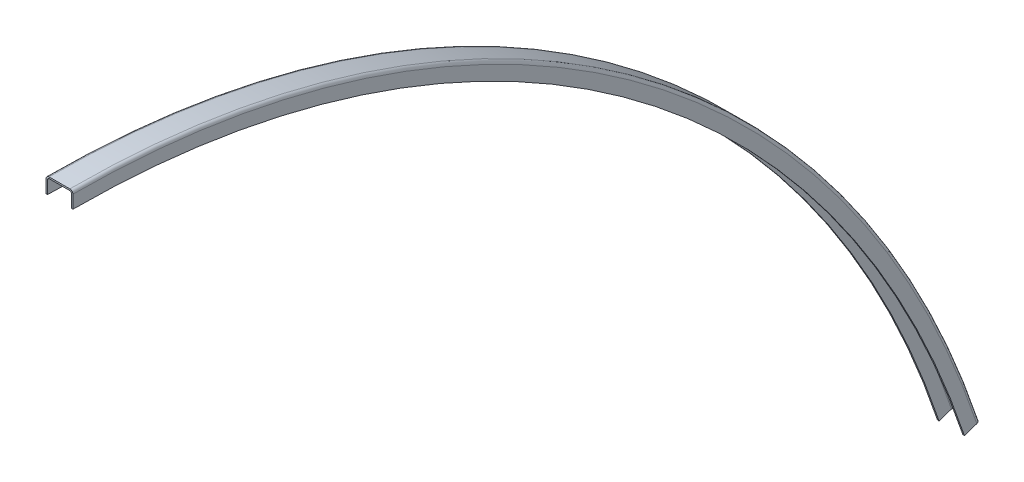
ISO-10303-21;
HEADER;
FILE_DESCRIPTION(('STEP AP214'),'2;1');
FILE_NAME('part.step','',(''),(''),'','','');
FILE_SCHEMA(('AUTOMOTIVE_DESIGN { 1 0 10303 214 1 1 1 1 }'));
ENDSEC;
DATA;
#1=APPLICATION_CONTEXT('core data for automotive mechanical design processes');
#2=APPLICATION_PROTOCOL_DEFINITION('international standard','automotive_design',2000,#1);
#3=PRODUCT_CONTEXT('',#1,'mechanical');
#4=PRODUCT('Part','Part','',(#3));
#5=PRODUCT_RELATED_PRODUCT_CATEGORY('part','',(#4));
#6=PRODUCT_DEFINITION_FORMATION('','',#4);
#7=PRODUCT_DEFINITION_CONTEXT('part definition',#1,'design');
#8=PRODUCT_DEFINITION('design','',#6,#7);
#9=PRODUCT_DEFINITION_SHAPE('','',#8);
#10=(LENGTH_UNIT() NAMED_UNIT(*) SI_UNIT(.MILLI.,.METRE.));
#11=(NAMED_UNIT(*) PLANE_ANGLE_UNIT() SI_UNIT($,.RADIAN.));
#12=(NAMED_UNIT(*) SI_UNIT($,.STERADIAN.) SOLID_ANGLE_UNIT());
#13=UNCERTAINTY_MEASURE_WITH_UNIT(LENGTH_MEASURE(1.E-05),#10,'distance_accuracy_value','');
#14=(GEOMETRIC_REPRESENTATION_CONTEXT(3) GLOBAL_UNCERTAINTY_ASSIGNED_CONTEXT((#13)) GLOBAL_UNIT_ASSIGNED_CONTEXT((#10,
#11,#12)) REPRESENTATION_CONTEXT('',''));
#15=CARTESIAN_POINT('',(0.,0.,0.));
#16=DIRECTION('',(0.,0.,1.));
#17=DIRECTION('',(1.,0.,0.));
#18=AXIS2_PLACEMENT_3D('',#15,#16,#17);
#19=CARTESIAN_POINT('',(14.479414078454,-1185.51851851852,0.));
#20=DIRECTION('',(1.,0.,0.));
#21=DIRECTION('',(0.,0.,-1.));
#22=AXIS2_PLACEMENT_3D('',#19,#20,#21);
#23=CYLINDRICAL_SURFACE('',#22,1223.5);
#24=CARTESIAN_POINT('',(-23.2037037037037,-1185.51851851852,0.));
#25=DIRECTION('',(1.,0.,0.));
#26=DIRECTION('',(0.,0.,-1.));
#27=AXIS2_PLACEMENT_3D('',#24,#25,#26);
#28=CIRCLE('',#27,1223.5);
#29=CARTESIAN_POINT('',(-23.2037037037037,-797.296271406891,-1160.27399214479));
#30=VERTEX_POINT('',#29);
#31=CARTESIAN_POINT('',(-23.2037037037037,37.9814814814815,0.));
#32=VERTEX_POINT('',#31);
#33=EDGE_CURVE('E11',#30,#32,#28,.T.);
#34=ORIENTED_EDGE('',*,*,#33,.F.);
#35=DIRECTION('',(1.,0.,0.));
#36=VECTOR('',#35,1.);
#37=CARTESIAN_POINT('',(-21.2037037037037,-797.296271406891,-1160.27399214479));
#38=LINE('',#37,#36);
#39=CARTESIAN_POINT('',(-21.2037037037037,-797.296271406891,-1160.27399214479));
#40=VERTEX_POINT('',#39);
#41=EDGE_CURVE('E123',#30,#40,#38,.T.);
#42=ORIENTED_EDGE('',*,*,#41,.T.);
#43=CARTESIAN_POINT('',(-21.2037037037037,-1185.51851851852,0.));
#44=DIRECTION('',(1.,0.,0.));
#45=DIRECTION('',(0.,0.,-1.));
#46=AXIS2_PLACEMENT_3D('',#43,#44,#45);
#47=CIRCLE('',#46,1223.5);
#48=CARTESIAN_POINT('',(-21.2037037037037,37.9814814814815,0.));
#49=VERTEX_POINT('',#48);
#50=EDGE_CURVE('E118',#40,#49,#47,.T.);
#51=ORIENTED_EDGE('',*,*,#50,.T.);
#52=DIRECTION('',(1.,0.,0.));
#53=VECTOR('',#52,1.);
#54=CARTESIAN_POINT('',(-21.2037037037037,37.9814814814815,0.));
#55=LINE('',#54,#53);
#56=EDGE_CURVE('E121',#32,#49,#55,.T.);
#57=ORIENTED_EDGE('',*,*,#56,.F.);
#58=EDGE_LOOP('',(#34,#42,#51,#57));
#59=FACE_BOUND('',#58,.T.);
#60=ADVANCED_FACE('F34',(#59),#23,.F.);
#61=CARTESIAN_POINT('',(-23.2037037037037,-797.296271406891,-1160.27399214479));
#62=DIRECTION('',(-1.,0.,0.));
#63=DIRECTION('',(0.,0.,1.));
#64=AXIS2_PLACEMENT_3D('',#61,#62,#63);
#65=PLANE('',#64);
#66=CARTESIAN_POINT('',(-23.2037037037037,-1185.51851851852,0.));
#67=DIRECTION('',(1.,0.,0.));
#68=DIRECTION('',(0.,0.,-1.));
#69=AXIS2_PLACEMENT_3D('',#66,#67,#68);
#70=CIRCLE('',#69,1240.5);
#71=CARTESIAN_POINT('',(-23.2037037037037,-791.902092248005,-1176.39549428329));
#72=VERTEX_POINT('',#71);
#73=CARTESIAN_POINT('',(-23.2037037037037,54.9814814814815,0.));
#74=VERTEX_POINT('',#73);
#75=EDGE_CURVE('E42',#72,#74,#70,.T.);
#76=ORIENTED_EDGE('',*,*,#75,.F.);
#77=DIRECTION('',(0.,-0.31730465640509,0.9483236552062));
#78=VECTOR('',#77,1.);
#79=CARTESIAN_POINT('',(-23.2037037037037,-797.296271406891,-1160.27399214479));
#80=LINE('',#79,#78);
#81=EDGE_CURVE('E128',#72,#30,#80,.T.);
#82=ORIENTED_EDGE('',*,*,#81,.T.);
#83=ORIENTED_EDGE('',*,*,#33,.T.);
#84=DIRECTION('',(0.,-1.,0.));
#85=VECTOR('',#84,1.);
#86=CARTESIAN_POINT('',(-23.2037037037037,37.9814814814815,0.));
#87=LINE('',#86,#85);
#88=EDGE_CURVE('E141',#74,#32,#87,.T.);
#89=ORIENTED_EDGE('',*,*,#88,.F.);
#90=EDGE_LOOP('',(#76,#82,#83,#89));
#91=FACE_BOUND('',#90,.T.);
#92=ADVANCED_FACE('F36',(#91),#65,.T.);
#93=CARTESIAN_POINT('',(-19.2037037037037,-1185.51851851852,0.));
#94=DIRECTION('',(1.,0.,0.));
#95=DIRECTION('',(0.,0.,-1.));
#96=AXIS2_PLACEMENT_3D('',#93,#94,#95);
#97=TOROIDAL_SURFACE('',#96,1240.5,4.);
#98=CARTESIAN_POINT('',(-19.2037037037037,-1185.51851851852,0.));
#99=DIRECTION('',(1.,0.,0.));
#100=DIRECTION('',(0.,0.,-1.));
#101=AXIS2_PLACEMENT_3D('',#98,#99,#100);
#102=CIRCLE('',#101,1244.5);
#103=CARTESIAN_POINT('',(-19.2037037037037,-790.632873622385,-1180.18878890412));
#104=VERTEX_POINT('',#103);
#105=CARTESIAN_POINT('',(-19.2037037037037,58.9814814814815,0.));
#106=VERTEX_POINT('',#105);
#107=EDGE_CURVE('E214',#104,#106,#102,.T.);
#108=ORIENTED_EDGE('',*,*,#107,.F.);
#109=CARTESIAN_POINT('',(-19.2037037037037,-791.902092248005,-1176.39549428329));
#110=DIRECTION('',(0.,0.9483236552062,0.31730465640509));
#111=DIRECTION('',(-1.,0.,0.));
#112=AXIS2_PLACEMENT_3D('',#109,#110,#111);
#113=CIRCLE('',#112,4.);
#114=EDGE_CURVE('E196',#104,#72,#113,.T.);
#115=ORIENTED_EDGE('',*,*,#114,.T.);
#116=ORIENTED_EDGE('',*,*,#75,.T.);
#117=CARTESIAN_POINT('',(-19.2037037037037,54.9814814814815,0.));
#118=DIRECTION('',(0.,0.,1.));
#119=DIRECTION('',(-1.,0.,0.));
#120=AXIS2_PLACEMENT_3D('',#117,#118,#119);
#121=CIRCLE('',#120,4.);
#122=EDGE_CURVE('E166',#106,#74,#121,.T.);
#123=ORIENTED_EDGE('',*,*,#122,.F.);
#124=EDGE_LOOP('',(#108,#115,#116,#123));
#125=FACE_BOUND('',#124,.T.);
#126=ADVANCED_FACE('F217',(#125),#97,.T.);
#127=CARTESIAN_POINT('',(14.479414078454,-1185.51851851852,0.));
#128=DIRECTION('',(1.,0.,0.));
#129=DIRECTION('',(0.,0.,-1.));
#130=AXIS2_PLACEMENT_3D('',#127,#128,#129);
#131=CYLINDRICAL_SURFACE('',#130,1244.5);
#132=CARTESIAN_POINT('',(7.79629629629627,-1185.51851851852,0.));
#133=DIRECTION('',(1.,0.,0.));
#134=DIRECTION('',(0.,0.,-1.));
#135=AXIS2_PLACEMENT_3D('',#132,#133,#134);
#136=CIRCLE('',#135,1244.5);
#137=CARTESIAN_POINT('',(7.79629629629627,-790.632873622385,-1180.18878890412));
#138=VERTEX_POINT('',#137);
#139=CARTESIAN_POINT('',(7.79629629629627,58.9814814814815,0.));
#140=VERTEX_POINT('',#139);
#141=EDGE_CURVE('E212',#138,#140,#136,.T.);
#142=ORIENTED_EDGE('',*,*,#141,.F.);
#143=DIRECTION('',(-1.,0.,0.));
#144=VECTOR('',#143,1.);
#145=CARTESIAN_POINT('',(-19.2037037037037,-790.632873622385,-1180.18878890412));
#146=LINE('',#145,#144);
#147=EDGE_CURVE('E193',#138,#104,#146,.T.);
#148=ORIENTED_EDGE('',*,*,#147,.T.);
#149=ORIENTED_EDGE('',*,*,#107,.T.);
#150=DIRECTION('',(-1.,0.,0.));
#151=VECTOR('',#150,1.);
#152=CARTESIAN_POINT('',(-19.2037037037037,58.9814814814815,0.));
#153=LINE('',#152,#151);
#154=EDGE_CURVE('E163',#140,#106,#153,.T.);
#155=ORIENTED_EDGE('',*,*,#154,.F.);
#156=EDGE_LOOP('',(#142,#148,#149,#155));
#157=FACE_BOUND('',#156,.T.);
#158=ADVANCED_FACE('F252',(#157),#131,.T.);
#159=CARTESIAN_POINT('',(7.79629629629629,-1185.51851851852,0.));
#160=DIRECTION('',(1.,0.,0.));
#161=DIRECTION('',(0.,0.,-1.));
#162=AXIS2_PLACEMENT_3D('',#159,#160,#161);
#163=TOROIDAL_SURFACE('',#162,1240.5,4.);
#164=CARTESIAN_POINT('',(11.7962962962963,-1185.51851851852,0.));
#165=DIRECTION('',(1.,0.,0.));
#166=DIRECTION('',(0.,0.,-1.));
#167=AXIS2_PLACEMENT_3D('',#164,#165,#166);
#168=CIRCLE('',#167,1240.5);
#169=CARTESIAN_POINT('',(11.7962962962963,-791.902092248005,-1176.39549428329));
#170=VERTEX_POINT('',#169);
#171=CARTESIAN_POINT('',(11.7962962962963,54.9814814814815,0.));
#172=VERTEX_POINT('',#171);
#173=EDGE_CURVE('E210',#170,#172,#168,.T.);
#174=ORIENTED_EDGE('',*,*,#173,.F.);
#175=CARTESIAN_POINT('',(7.79629629629629,-791.902092248005,-1176.39549428329));
#176=DIRECTION('',(0.,0.9483236552062,0.31730465640509));
#177=DIRECTION('',(-1.,0.,0.));
#178=AXIS2_PLACEMENT_3D('',#175,#176,#177);
#179=CIRCLE('',#178,4.);
#180=EDGE_CURVE('E190',#170,#138,#179,.T.);
#181=ORIENTED_EDGE('',*,*,#180,.T.);
#182=ORIENTED_EDGE('',*,*,#141,.T.);
#183=CARTESIAN_POINT('',(7.79629629629629,54.9814814814815,0.));
#184=DIRECTION('',(0.,0.,1.));
#185=DIRECTION('',(-1.,0.,0.));
#186=AXIS2_PLACEMENT_3D('',#183,#184,#185);
#187=CIRCLE('',#186,4.);
#188=EDGE_CURVE('E160',#172,#140,#187,.T.);
#189=ORIENTED_EDGE('',*,*,#188,.F.);
#190=EDGE_LOOP('',(#174,#181,#182,#189));
#191=FACE_BOUND('',#190,.T.);
#192=ADVANCED_FACE('F249',(#191),#163,.T.);
#193=CARTESIAN_POINT('',(11.7962962962963,-791.902092248005,-1176.39549428329));
#194=DIRECTION('',(1.,0.,0.));
#195=DIRECTION('',(0.,0.,-1.));
#196=AXIS2_PLACEMENT_3D('',#193,#194,#195);
#197=PLANE('',#196);
#198=CARTESIAN_POINT('',(11.7962962962963,-1185.51851851852,0.));
#199=DIRECTION('',(1.,0.,0.));
#200=DIRECTION('',(0.,0.,-1.));
#201=AXIS2_PLACEMENT_3D('',#198,#199,#200);
#202=CIRCLE('',#201,1223.5);
#203=CARTESIAN_POINT('',(11.7962962962963,-797.296271406891,-1160.27399214479));
#204=VERTEX_POINT('',#203);
#205=CARTESIAN_POINT('',(11.7962962962963,37.9814814814815,0.));
#206=VERTEX_POINT('',#205);
#207=EDGE_CURVE('E208',#204,#206,#202,.T.);
#208=ORIENTED_EDGE('',*,*,#207,.F.);
#209=DIRECTION('',(0.,0.31730465640509,-0.9483236552062));
#210=VECTOR('',#209,1.);
#211=CARTESIAN_POINT('',(11.7962962962963,-791.902092248005,-1176.39549428329));
#212=LINE('',#211,#210);
#213=EDGE_CURVE('E187',#204,#170,#212,.T.);
#214=ORIENTED_EDGE('',*,*,#213,.T.);
#215=ORIENTED_EDGE('',*,*,#173,.T.);
#216=DIRECTION('',(0.,1.,0.));
#217=VECTOR('',#216,1.);
#218=CARTESIAN_POINT('',(11.7962962962963,54.9814814814815,0.));
#219=LINE('',#218,#217);
#220=EDGE_CURVE('E157',#206,#172,#219,.T.);
#221=ORIENTED_EDGE('',*,*,#220,.F.);
#222=EDGE_LOOP('',(#208,#214,#215,#221));
#223=FACE_BOUND('',#222,.T.);
#224=ADVANCED_FACE('F246',(#223),#197,.T.);
#225=CARTESIAN_POINT('',(14.479414078454,-1185.51851851852,0.));
#226=DIRECTION('',(1.,0.,0.));
#227=DIRECTION('',(0.,0.,-1.));
#228=AXIS2_PLACEMENT_3D('',#225,#226,#227);
#229=CYLINDRICAL_SURFACE('',#228,1223.5);
#230=CARTESIAN_POINT('',(9.7962962962963,-1185.51851851852,0.));
#231=DIRECTION('',(1.,0.,0.));
#232=DIRECTION('',(0.,0.,-1.));
#233=AXIS2_PLACEMENT_3D('',#230,#231,#232);
#234=CIRCLE('',#233,1223.5);
#235=CARTESIAN_POINT('',(9.7962962962963,-797.296271406891,-1160.27399214479));
#236=VERTEX_POINT('',#235);
#237=CARTESIAN_POINT('',(9.7962962962963,37.9814814814815,0.));
#238=VERTEX_POINT('',#237);
#239=EDGE_CURVE('E206',#236,#238,#234,.T.);
#240=ORIENTED_EDGE('',*,*,#239,.F.);
#241=DIRECTION('',(1.,0.,0.));
#242=VECTOR('',#241,1.);
#243=CARTESIAN_POINT('',(11.7962962962963,-797.296271406891,-1160.27399214479));
#244=LINE('',#243,#242);
#245=EDGE_CURVE('E184',#236,#204,#244,.T.);
#246=ORIENTED_EDGE('',*,*,#245,.T.);
#247=ORIENTED_EDGE('',*,*,#207,.T.);
#248=DIRECTION('',(1.,0.,0.));
#249=VECTOR('',#248,1.);
#250=CARTESIAN_POINT('',(11.7962962962963,37.9814814814815,0.));
#251=LINE('',#250,#249);
#252=EDGE_CURVE('E154',#238,#206,#251,.T.);
#253=ORIENTED_EDGE('',*,*,#252,.F.);
#254=EDGE_LOOP('',(#240,#246,#247,#253));
#255=FACE_BOUND('',#254,.T.);
#256=ADVANCED_FACE('F241',(#255),#229,.F.);
#257=CARTESIAN_POINT('',(9.7962962962963,-797.296271406891,-1160.27399214479));
#258=DIRECTION('',(-1.,0.,0.));
#259=DIRECTION('',(0.,0.,1.));
#260=AXIS2_PLACEMENT_3D('',#257,#258,#259);
#261=PLANE('',#260);
#262=CARTESIAN_POINT('',(9.7962962962963,-1185.51851851852,0.));
#263=DIRECTION('',(1.,0.,0.));
#264=DIRECTION('',(0.,0.,-1.));
#265=AXIS2_PLACEMENT_3D('',#262,#263,#264);
#266=CIRCLE('',#265,1240.5);
#267=CARTESIAN_POINT('',(9.7962962962963,-791.902092248005,-1176.39549428329));
#268=VERTEX_POINT('',#267);
#269=CARTESIAN_POINT('',(9.7962962962963,54.9814814814815,0.));
#270=VERTEX_POINT('',#269);
#271=EDGE_CURVE('E204',#268,#270,#266,.T.);
#272=ORIENTED_EDGE('',*,*,#271,.F.);
#273=DIRECTION('',(0.,-0.31730465640509,0.9483236552062));
#274=VECTOR('',#273,1.);
#275=CARTESIAN_POINT('',(9.7962962962963,-797.296271406891,-1160.27399214479));
#276=LINE('',#275,#274);
#277=EDGE_CURVE('E181',#268,#236,#276,.T.);
#278=ORIENTED_EDGE('',*,*,#277,.T.);
#279=ORIENTED_EDGE('',*,*,#239,.T.);
#280=DIRECTION('',(0.,-1.,0.));
#281=VECTOR('',#280,1.);
#282=CARTESIAN_POINT('',(9.7962962962963,37.9814814814815,0.));
#283=LINE('',#282,#281);
#284=EDGE_CURVE('E151',#270,#238,#283,.T.);
#285=ORIENTED_EDGE('',*,*,#284,.F.);
#286=EDGE_LOOP('',(#272,#278,#279,#285));
#287=FACE_BOUND('',#286,.T.);
#288=ADVANCED_FACE('F238',(#287),#261,.T.);
#289=CARTESIAN_POINT('',(7.7962962962963,-1185.51851851852,0.));
#290=DIRECTION('',(1.,0.,0.));
#291=DIRECTION('',(0.,0.,-1.));
#292=AXIS2_PLACEMENT_3D('',#289,#290,#291);
#293=TOROIDAL_SURFACE('',#292,1240.5,2.);
#294=CARTESIAN_POINT('',(7.79629629629628,-1185.51851851852,0.));
#295=DIRECTION('',(1.,0.,0.));
#296=DIRECTION('',(0.,0.,-1.));
#297=AXIS2_PLACEMENT_3D('',#294,#295,#296);
#298=CIRCLE('',#297,1242.5);
#299=CARTESIAN_POINT('',(7.79629629629628,-791.267482935195,-1178.2921415937));
#300=VERTEX_POINT('',#299);
#301=CARTESIAN_POINT('',(7.79629629629628,56.9814814814815,0.));
#302=VERTEX_POINT('',#301);
#303=EDGE_CURVE('E202',#300,#302,#298,.T.);
#304=ORIENTED_EDGE('',*,*,#303,.F.);
#305=CARTESIAN_POINT('',(7.7962962962963,-791.902092248005,-1176.39549428329));
#306=DIRECTION('',(0.,-0.9483236552062,-0.31730465640509));
#307=DIRECTION('',(1.,0.,0.));
#308=AXIS2_PLACEMENT_3D('',#305,#306,#307);
#309=CIRCLE('',#308,2.);
#310=EDGE_CURVE('E178',#300,#268,#309,.T.);
#311=ORIENTED_EDGE('',*,*,#310,.T.);
#312=ORIENTED_EDGE('',*,*,#271,.T.);
#313=CARTESIAN_POINT('',(7.7962962962963,54.9814814814815,0.));
#314=DIRECTION('',(0.,0.,-1.));
#315=DIRECTION('',(1.,0.,0.));
#316=AXIS2_PLACEMENT_3D('',#313,#314,#315);
#317=CIRCLE('',#316,2.);
#318=EDGE_CURVE('E148',#302,#270,#317,.T.);
#319=ORIENTED_EDGE('',*,*,#318,.F.);
#320=EDGE_LOOP('',(#304,#311,#312,#319));
#321=FACE_BOUND('',#320,.T.);
#322=ADVANCED_FACE('F233',(#321),#293,.F.);
#323=CARTESIAN_POINT('',(14.479414078454,-1185.51851851852,0.));
#324=DIRECTION('',(1.,0.,0.));
#325=DIRECTION('',(0.,0.,-1.));
#326=AXIS2_PLACEMENT_3D('',#323,#324,#325);
#327=CYLINDRICAL_SURFACE('',#326,1242.5);
#328=CARTESIAN_POINT('',(-19.2037037037037,-1185.51851851852,0.));
#329=DIRECTION('',(1.,0.,0.));
#330=DIRECTION('',(0.,0.,-1.));
#331=AXIS2_PLACEMENT_3D('',#328,#329,#330);
#332=CIRCLE('',#331,1242.5);
#333=CARTESIAN_POINT('',(-19.2037037037037,-791.267482935195,-1178.2921415937));
#334=VERTEX_POINT('',#333);
#335=CARTESIAN_POINT('',(-19.2037037037037,56.9814814814815,0.));
#336=VERTEX_POINT('',#335);
#337=EDGE_CURVE('E200',#334,#336,#332,.T.);
#338=ORIENTED_EDGE('',*,*,#337,.F.);
#339=DIRECTION('',(1.,0.,0.));
#340=VECTOR('',#339,1.);
#341=CARTESIAN_POINT('',(7.79629629629628,-791.267482935195,-1178.2921415937));
#342=LINE('',#341,#340);
#343=EDGE_CURVE('E175',#334,#300,#342,.T.);
#344=ORIENTED_EDGE('',*,*,#343,.T.);
#345=ORIENTED_EDGE('',*,*,#303,.T.);
#346=DIRECTION('',(1.,0.,0.));
#347=VECTOR('',#346,1.);
#348=CARTESIAN_POINT('',(7.79629629629628,56.9814814814815,0.));
#349=LINE('',#348,#347);
#350=EDGE_CURVE('E145',#336,#302,#349,.T.);
#351=ORIENTED_EDGE('',*,*,#350,.F.);
#352=EDGE_LOOP('',(#338,#344,#345,#351));
#353=FACE_BOUND('',#352,.T.);
#354=ADVANCED_FACE('F231',(#353),#327,.F.);
#355=CARTESIAN_POINT('',(-19.2037037037037,-1185.51851851852,0.));
#356=DIRECTION('',(1.,0.,0.));
#357=DIRECTION('',(0.,0.,-1.));
#358=AXIS2_PLACEMENT_3D('',#355,#356,#357);
#359=TOROIDAL_SURFACE('',#358,1240.5,2.);
#360=CARTESIAN_POINT('',(-21.2037037037037,-1185.51851851852,0.));
#361=DIRECTION('',(1.,0.,0.));
#362=DIRECTION('',(0.,0.,-1.));
#363=AXIS2_PLACEMENT_3D('',#360,#361,#362);
#364=CIRCLE('',#363,1240.5);
#365=CARTESIAN_POINT('',(-21.2037037037037,-791.902092248005,-1176.39549428329));
#366=VERTEX_POINT('',#365);
#367=CARTESIAN_POINT('',(-21.2037037037037,54.9814814814815,0.));
#368=VERTEX_POINT('',#367);
#369=EDGE_CURVE('E127',#366,#368,#364,.T.);
#370=ORIENTED_EDGE('',*,*,#369,.F.);
#371=CARTESIAN_POINT('',(-19.2037037037037,-791.902092248005,-1176.39549428329));
#372=DIRECTION('',(0.,-0.9483236552062,-0.31730465640509));
#373=DIRECTION('',(-1.,0.,0.));
#374=AXIS2_PLACEMENT_3D('',#371,#372,#373);
#375=CIRCLE('',#374,2.);
#376=EDGE_CURVE('E172',#366,#334,#375,.T.);
#377=ORIENTED_EDGE('',*,*,#376,.T.);
#378=ORIENTED_EDGE('',*,*,#337,.T.);
#379=CARTESIAN_POINT('',(-19.2037037037037,54.9814814814815,0.));
#380=DIRECTION('',(0.,0.,-1.));
#381=DIRECTION('',(-1.,0.,0.));
#382=AXIS2_PLACEMENT_3D('',#379,#380,#381);
#383=CIRCLE('',#382,2.);
#384=EDGE_CURVE('E136',#368,#336,#383,.T.);
#385=ORIENTED_EDGE('',*,*,#384,.F.);
#386=EDGE_LOOP('',(#370,#377,#378,#385));
#387=FACE_BOUND('',#386,.T.);
#388=ADVANCED_FACE('F227',(#387),#359,.F.);
#389=CARTESIAN_POINT('',(-21.2037037037037,-791.902092248005,-1176.39549428329));
#390=DIRECTION('',(1.,0.,0.));
#391=DIRECTION('',(0.,0.,-1.));
#392=AXIS2_PLACEMENT_3D('',#389,#390,#391);
#393=PLANE('',#392);
#394=DIRECTION('',(0.,0.31730465640509,-0.9483236552062));
#395=VECTOR('',#394,1.);
#396=CARTESIAN_POINT('',(-21.2037037037037,-791.902092248005,-1176.39549428329));
#397=LINE('',#396,#395);
#398=EDGE_CURVE('E170',#40,#366,#397,.T.);
#399=ORIENTED_EDGE('',*,*,#398,.T.);
#400=ORIENTED_EDGE('',*,*,#369,.T.);
#401=DIRECTION('',(0.,1.,0.));
#402=VECTOR('',#401,1.);
#403=CARTESIAN_POINT('',(-21.2037037037037,54.9814814814815,0.));
#404=LINE('',#403,#402);
#405=EDGE_CURVE('E131',#49,#368,#404,.T.);
#406=ORIENTED_EDGE('',*,*,#405,.F.);
#407=ORIENTED_EDGE('',*,*,#50,.F.);
#408=EDGE_LOOP('',(#399,#400,#406,#407));
#409=FACE_BOUND('',#408,.T.);
#410=ADVANCED_FACE('F132',(#409),#393,.T.);
#411=CARTESIAN_POINT('',(-19.2037037037037,-791.902092248005,-1176.39549428329));
#412=DIRECTION('',(0.,-0.9483236552062,-0.31730465640509));
#413=DIRECTION('',(-1.,0.,0.));
#414=AXIS2_PLACEMENT_3D('',#411,#412,#413);
#415=PLANE('',#414);
#416=ORIENTED_EDGE('',*,*,#41,.F.);
#417=ORIENTED_EDGE('',*,*,#81,.F.);
#418=ORIENTED_EDGE('',*,*,#114,.F.);
#419=ORIENTED_EDGE('',*,*,#147,.F.);
#420=ORIENTED_EDGE('',*,*,#180,.F.);
#421=ORIENTED_EDGE('',*,*,#213,.F.);
#422=ORIENTED_EDGE('',*,*,#245,.F.);
#423=ORIENTED_EDGE('',*,*,#277,.F.);
#424=ORIENTED_EDGE('',*,*,#310,.F.);
#425=ORIENTED_EDGE('',*,*,#343,.F.);
#426=ORIENTED_EDGE('',*,*,#376,.F.);
#427=ORIENTED_EDGE('',*,*,#398,.F.);
#428=EDGE_LOOP('',(#416,#417,#418,#419,#420,#421,#422,#423,#424,#425,#426,#427));
#429=FACE_BOUND('',#428,.T.);
#430=ADVANCED_FACE('F222',(#429),#415,.T.);
#431=CARTESIAN_POINT('',(-19.2037037037037,54.9814814814815,0.));
#432=DIRECTION('',(0.,0.,-1.));
#433=DIRECTION('',(-1.,0.,0.));
#434=AXIS2_PLACEMENT_3D('',#431,#432,#433);
#435=PLANE('',#434);
#436=ORIENTED_EDGE('',*,*,#56,.T.);
#437=ORIENTED_EDGE('',*,*,#405,.T.);
#438=ORIENTED_EDGE('',*,*,#384,.T.);
#439=ORIENTED_EDGE('',*,*,#350,.T.);
#440=ORIENTED_EDGE('',*,*,#318,.T.);
#441=ORIENTED_EDGE('',*,*,#284,.T.);
#442=ORIENTED_EDGE('',*,*,#252,.T.);
#443=ORIENTED_EDGE('',*,*,#220,.T.);
#444=ORIENTED_EDGE('',*,*,#188,.T.);
#445=ORIENTED_EDGE('',*,*,#154,.T.);
#446=ORIENTED_EDGE('',*,*,#122,.T.);
#447=ORIENTED_EDGE('',*,*,#88,.T.);
#448=EDGE_LOOP('',(#436,#437,#438,#439,#440,#441,#442,#443,#444,#445,#446,#447));
#449=FACE_BOUND('',#448,.T.);
#450=ADVANCED_FACE('F139',(#449),#435,.F.);
#451=CLOSED_SHELL('',(#60,#92,#126,#158,#192,#224,#256,#288,#322,#354,#388,#410,#430,#450));
#452=MANIFOLD_SOLID_BREP('B2',#451);
#453=ADVANCED_BREP_SHAPE_REPRESENTATION('',(#18,#452),#14);
#454=SHAPE_DEFINITION_REPRESENTATION(#9,#453);
ENDSEC;
END-ISO-10303-21;
